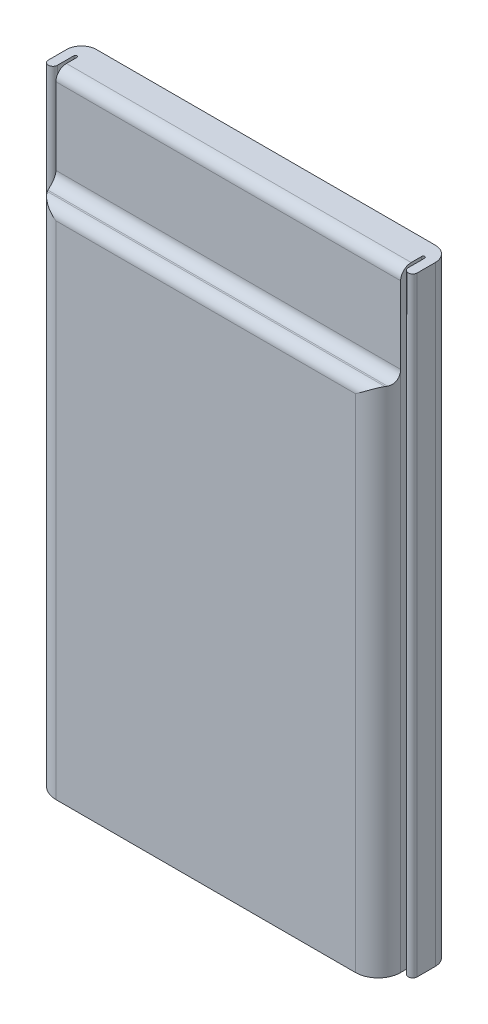
ISO-10303-21;
HEADER;
FILE_DESCRIPTION(('STEP AP214'),'2;1');
FILE_NAME('part.step','',(''),(''),'','','');
FILE_SCHEMA(('AUTOMOTIVE_DESIGN { 1 0 10303 214 1 1 1 1 }'));
ENDSEC;
DATA;
#1=APPLICATION_CONTEXT('core data for automotive mechanical design processes');
#2=APPLICATION_PROTOCOL_DEFINITION('international standard','automotive_design',2000,#1);
#3=PRODUCT_CONTEXT('',#1,'mechanical');
#4=PRODUCT('Part','Part','',(#3));
#5=PRODUCT_RELATED_PRODUCT_CATEGORY('part','',(#4));
#6=PRODUCT_DEFINITION_FORMATION('','',#4);
#7=PRODUCT_DEFINITION_CONTEXT('part definition',#1,'design');
#8=PRODUCT_DEFINITION('design','',#6,#7);
#9=PRODUCT_DEFINITION_SHAPE('','',#8);
#10=(LENGTH_UNIT() NAMED_UNIT(*) SI_UNIT(.MILLI.,.METRE.));
#11=(NAMED_UNIT(*) PLANE_ANGLE_UNIT() SI_UNIT($,.RADIAN.));
#12=(NAMED_UNIT(*) SI_UNIT($,.STERADIAN.) SOLID_ANGLE_UNIT());
#13=UNCERTAINTY_MEASURE_WITH_UNIT(LENGTH_MEASURE(1.E-05),#10,'distance_accuracy_value','');
#14=(GEOMETRIC_REPRESENTATION_CONTEXT(3) GLOBAL_UNCERTAINTY_ASSIGNED_CONTEXT((#13)) GLOBAL_UNIT_ASSIGNED_CONTEXT((#10,
#11,#12)) REPRESENTATION_CONTEXT('',''));
#15=CARTESIAN_POINT('',(0.,0.,0.));
#16=DIRECTION('',(0.,0.,1.));
#17=DIRECTION('',(1.,0.,0.));
#18=AXIS2_PLACEMENT_3D('',#15,#16,#17);
#19=CARTESIAN_POINT('',(-11.45,20.25,2.5));
#20=DIRECTION('',(1.,0.,0.));
#21=DIRECTION('',(0.,0.,-1.));
#22=AXIS2_PLACEMENT_3D('',#19,#20,#21);
#23=PLANE('',#22);
#24=CARTESIAN_POINT('',(-11.45,19.55,1.8));
#25=DIRECTION('',(1.,0.,0.));
#26=DIRECTION('',(0.,0.,-1.));
#27=AXIS2_PLACEMENT_3D('',#24,#25,#26);
#28=CIRCLE('',#27,0.700000000000001);
#29=CARTESIAN_POINT('',(-11.45,20.25,1.8));
#30=VERTEX_POINT('',#29);
#31=CARTESIAN_POINT('',(-11.45,19.55,2.5));
#32=VERTEX_POINT('',#31);
#33=EDGE_CURVE('E452',#30,#32,#28,.T.);
#34=ORIENTED_EDGE('',*,*,#33,.F.);
#35=DIRECTION('',(0.,0.,1.));
#36=VECTOR('',#35,1.);
#37=CARTESIAN_POINT('',(-11.45,20.25,2.5));
#38=LINE('',#37,#36);
#39=CARTESIAN_POINT('',(-11.45,20.25,1.1));
#40=VERTEX_POINT('',#39);
#41=EDGE_CURVE('E268',#40,#30,#38,.T.);
#42=ORIENTED_EDGE('',*,*,#41,.F.);
#43=DIRECTION('',(0.,-1.,0.));
#44=VECTOR('',#43,1.);
#45=CARTESIAN_POINT('',(-11.45,20.25,1.1));
#46=LINE('',#45,#44);
#47=CARTESIAN_POINT('',(-11.45,-20.25,1.1));
#48=VERTEX_POINT('',#47);
#49=EDGE_CURVE('E236',#40,#48,#46,.T.);
#50=ORIENTED_EDGE('',*,*,#49,.T.);
#51=DIRECTION('',(0.,0.,1.));
#52=VECTOR('',#51,1.);
#53=CARTESIAN_POINT('',(-11.45,-20.25,2.5));
#54=LINE('',#53,#52);
#55=CARTESIAN_POINT('',(-11.45,-20.25,2.5));
#56=VERTEX_POINT('',#55);
#57=EDGE_CURVE('E191',#48,#56,#54,.T.);
#58=ORIENTED_EDGE('',*,*,#57,.T.);
#59=DIRECTION('',(0.,-1.,0.));
#60=VECTOR('',#59,1.);
#61=CARTESIAN_POINT('',(-11.45,20.25,2.5));
#62=LINE('',#61,#60);
#63=CARTESIAN_POINT('',(-11.45,14.45,2.5));
#64=VERTEX_POINT('',#63);
#65=EDGE_CURVE('E234',#64,#56,#62,.T.);
#66=ORIENTED_EDGE('',*,*,#65,.F.);
#67=DIRECTION('',(0.,-1.,0.));
#68=VECTOR('',#67,1.);
#69=CARTESIAN_POINT('',(-11.45,20.25,2.5));
#70=LINE('',#69,#68);
#71=EDGE_CURVE('E435',#32,#64,#70,.T.);
#72=ORIENTED_EDGE('',*,*,#71,.F.);
#73=EDGE_LOOP('',(#34,#42,#50,#58,#66,#72));
#74=FACE_BOUND('',#73,.T.);
#75=ADVANCED_FACE('F35',(#74),#23,.F.);
#76=CARTESIAN_POINT('',(-9.95,20.25,2.5));
#77=DIRECTION('',(0.,-1.,0.));
#78=DIRECTION('',(0.,0.,-1.));
#79=AXIS2_PLACEMENT_3D('',#76,#77,#78);
#80=CYLINDRICAL_SURFACE('',#79,1.5);
#81=CARTESIAN_POINT('',(-11.45,14.45,2.5));
#82=CARTESIAN_POINT('',(-11.4499561462918,14.4107046356708,2.49996665730778));
#83=CARTESIAN_POINT('',(-11.4499992482191,14.3714183542362,2.50330687650236));
#84=CARTESIAN_POINT('',(-11.4499354164387,14.293967429043,2.51649162392108));
#85=CARTESIAN_POINT('',(-11.4498285413028,14.2558023533524,2.52633361216168));
#86=CARTESIAN_POINT('',(-11.4491410740691,14.1816427129099,2.55228720768836));
#87=CARTESIAN_POINT('',(-11.448560198109,14.145649462663,2.56840256885166));
#88=CARTESIAN_POINT('',(-11.4463416248353,14.0768985139939,2.60642040046059));
#89=CARTESIAN_POINT('',(-11.4447040963163,14.0441402997553,2.62832194626366));
#90=CARTESIAN_POINT('',(-11.4397174760021,13.9831035334169,2.677010616108));
#91=CARTESIAN_POINT('',(-11.4363838519975,13.9547874718156,2.70375220489332));
#92=CARTESIAN_POINT('',(-11.4273485077593,13.9031440562724,2.76131822449821));
#93=CARTESIAN_POINT('',(-11.4216483772418,13.879813369279,2.79213990504022));
#94=CARTESIAN_POINT('',(-11.4076029305689,13.8395024190182,2.85553925871004));
#95=CARTESIAN_POINT('',(-11.3993602479741,13.8223237472487,2.88801374582642));
#96=CARTESIAN_POINT('',(-11.3799019482591,13.7934557940061,2.95451175346917));
#97=CARTESIAN_POINT('',(-11.3686838942042,13.781771034092,2.98853652472772));
#98=CARTESIAN_POINT('',(-11.3449002980657,13.7650221516101,3.05250454046783));
#99=CARTESIAN_POINT('',(-11.3326903337623,13.7593026309378,3.08241352289095));
#100=CARTESIAN_POINT('',(-11.3061914981021,13.7517861713414,3.14172953845446));
#101=CARTESIAN_POINT('',(-11.2919070504446,13.749981012626,3.17113749452254));
#102=CARTESIAN_POINT('',(-11.2766499161422,13.75,3.2));
#103=B_SPLINE_CURVE_WITH_KNOTS('',3,(#81,#82,#83,#84,#85,#86,#87,#88,#89,#90,#91,#92,#93,#94,
#95,#96,#97,#98,#99,#100,#101,#102),.UNSPECIFIED.,.F.,.F.,(4,2,2,2,2,2,2,2,2,2,4),(0.,
0.117731700981388,0.235417436029151,0.353173700690374,0.470911159062051,0.587593641092845,
0.70419786741187,0.816603597131317,0.929101676953001,1.0272186022184,1.12512929085055),.UNSPECIFIED.);
#104=CARTESIAN_POINT('',(-11.2766499161422,13.75,3.2));
#105=VERTEX_POINT('',#104);
#106=EDGE_CURVE('E432',#64,#105,#103,.T.);
#107=ORIENTED_EDGE('',*,*,#106,.F.);
#108=ORIENTED_EDGE('',*,*,#65,.T.);
#109=CARTESIAN_POINT('',(-9.95,-20.25,2.5));
#110=DIRECTION('',(0.,1.,0.));
#111=DIRECTION('',(0.,0.,1.));
#112=AXIS2_PLACEMENT_3D('',#109,#110,#111);
#113=CIRCLE('',#112,1.5);
#114=CARTESIAN_POINT('',(-9.95,-20.25,4.));
#115=VERTEX_POINT('',#114);
#116=EDGE_CURVE('E194',#56,#115,#113,.T.);
#117=ORIENTED_EDGE('',*,*,#116,.T.);
#118=DIRECTION('',(0.,-1.,0.));
#119=VECTOR('',#118,1.);
#120=CARTESIAN_POINT('',(-9.95,20.25,4.));
#121=LINE('',#120,#119);
#122=CARTESIAN_POINT('',(-9.95,13.05,4.));
#123=VERTEX_POINT('',#122);
#124=EDGE_CURVE('E232',#123,#115,#121,.T.);
#125=ORIENTED_EDGE('',*,*,#124,.F.);
#126=CARTESIAN_POINT('',(-11.218857754045,13.75,3.3));
#127=CARTESIAN_POINT('',(-11.2027784417981,13.7499982055545,3.32551396463836));
#128=CARTESIAN_POINT('',(-11.1859410582917,13.7486060689017,3.35050252186088));
#129=CARTESIAN_POINT('',(-11.1509676886166,13.7433665296013,3.39920481996247));
#130=CARTESIAN_POINT('',(-11.1328347064415,13.7395246527944,3.42292130005024));
#131=CARTESIAN_POINT('',(-11.0771702625634,13.724922406964,3.49142221954591));
#132=CARTESIAN_POINT('',(-11.0379636566091,13.7110687175682,3.53420132491162));
#133=CARTESIAN_POINT('',(-10.9458598687308,13.672878872689,3.62401554035445));
#134=CARTESIAN_POINT('',(-10.8920377008067,13.6467617112175,3.66930815190718));
#135=CARTESIAN_POINT('',(-10.7808303258263,13.587882443994,3.75080325405991));
#136=CARTESIAN_POINT('',(-10.7234254431628,13.5550808982158,3.78694879598609));
#137=CARTESIAN_POINT('',(-10.5825796058719,13.4708369597608,3.86331326015554));
#138=CARTESIAN_POINT('',(-10.4980697193284,13.417248573335,3.89917970849284));
#139=CARTESIAN_POINT('',(-10.3270548572683,13.3056468566581,3.95461504825333));
#140=CARTESIAN_POINT('',(-10.240552975085,13.2476401017938,3.97420766027137));
#141=CARTESIAN_POINT('',(-10.0880345556902,13.1442840524471,3.99509898601819));
#142=CARTESIAN_POINT('',(-10.022197069673,13.0993196280477,3.99970591144029));
#143=CARTESIAN_POINT('',(-9.95426397648777,13.0529128504283,3.99999545061156));
#144=CARTESIAN_POINT('',(-9.95213196446319,13.0514564089068,3.99999999550149));
#145=CARTESIAN_POINT('',(-9.95,13.05,4.));
#146=B_SPLINE_CURVE_WITH_KNOTS('',3,(#126,#127,#128,#129,#130,#131,#132,#133,#134,#135,#136,
#137,#138,#139,#140,#141,#142,#143,#144,#145),.UNSPECIFIED.,.F.,.F.,(4,2,2,2,2,2,2,2,2,4),(0.,
0.0903647747938606,0.180526432789836,0.358599701535537,0.582545843187154,0.807853726825027,
1.12506490330324,1.44181290024313,1.68087549653736,1.688621475233),.UNSPECIFIED.);
#147=CARTESIAN_POINT('',(-11.218857754045,13.75,3.3));
#148=VERTEX_POINT('',#147);
#149=EDGE_CURVE('E433',#148,#123,#146,.T.);
#150=ORIENTED_EDGE('',*,*,#149,.F.);
#151=CARTESIAN_POINT('',(-9.95,13.75,2.5));
#152=DIRECTION('',(0.,-1.,0.));
#153=DIRECTION('',(0.,0.,-1.));
#154=AXIS2_PLACEMENT_3D('',#151,#152,#153);
#155=CIRCLE('',#154,1.5);
#156=EDGE_CURVE('E426',#105,#148,#155,.F.);
#157=ORIENTED_EDGE('',*,*,#156,.F.);
#158=EDGE_LOOP('',(#107,#108,#117,#125,#150,#157));
#159=FACE_BOUND('',#158,.T.);
#160=ADVANCED_FACE('F360',(#159),#80,.T.);
#161=CARTESIAN_POINT('',(9.95000000000001,20.25,2.5));
#162=DIRECTION('',(0.,-1.,0.));
#163=DIRECTION('',(0.,0.,-1.));
#164=AXIS2_PLACEMENT_3D('',#161,#162,#163);
#165=CYLINDRICAL_SURFACE('',#164,1.5);
#166=CARTESIAN_POINT('',(11.45,14.45,2.5));
#167=CARTESIAN_POINT('',(11.4499561462918,14.4107046356708,2.49996665730778));
#168=CARTESIAN_POINT('',(11.4499992482191,14.3714183542362,2.50330687650236));
#169=CARTESIAN_POINT('',(11.4499354164387,14.293967429043,2.51649162392108));
#170=CARTESIAN_POINT('',(11.4498285413028,14.2558023533524,2.52633361216168));
#171=CARTESIAN_POINT('',(11.4491410740691,14.1816427129099,2.55228720768836));
#172=CARTESIAN_POINT('',(11.448560198109,14.145649462663,2.56840256885166));
#173=CARTESIAN_POINT('',(11.4463416248353,14.0768985139939,2.60642040046059));
#174=CARTESIAN_POINT('',(11.4447040963163,14.0441402997553,2.62832194626366));
#175=CARTESIAN_POINT('',(11.4397174760021,13.9831035334169,2.677010616108));
#176=CARTESIAN_POINT('',(11.4363838519975,13.9547874718156,2.70375220489331));
#177=CARTESIAN_POINT('',(11.4273485077593,13.9031440562724,2.76131822449821));
#178=CARTESIAN_POINT('',(11.4216483772418,13.879813369279,2.79213990504022));
#179=CARTESIAN_POINT('',(11.4076029305689,13.8395024190182,2.85553925871004));
#180=CARTESIAN_POINT('',(11.3993602479741,13.8223237472487,2.88801374582642));
#181=CARTESIAN_POINT('',(11.3799019482591,13.7934557940061,2.95451175346917));
#182=CARTESIAN_POINT('',(11.3686838942042,13.781771034092,2.98853652472772));
#183=CARTESIAN_POINT('',(11.3449002980657,13.7650221516101,3.05250454046783));
#184=CARTESIAN_POINT('',(11.3326903337623,13.7593026309378,3.08241352289095));
#185=CARTESIAN_POINT('',(11.3061914981021,13.7517861713414,3.14172953845446));
#186=CARTESIAN_POINT('',(11.2919070504447,13.749981012626,3.17113749452254));
#187=CARTESIAN_POINT('',(11.2766499161422,13.75,3.2));
#188=B_SPLINE_CURVE_WITH_KNOTS('',3,(#166,#167,#168,#169,#170,#171,#172,#173,#174,#175,#176,
#177,#178,#179,#180,#181,#182,#183,#184,#185,#186,#187),.UNSPECIFIED.,.F.,.F.,(4,2,2,2,2,2,2,2,
2,2,4),(0.,0.117731700981388,0.235417436029151,0.353173700690374,0.470911159062051,
0.587593641092844,0.704197867411869,0.816603597131317,0.929101676953001,1.0272186022184,
1.12512929085055),.UNSPECIFIED.);
#189=CARTESIAN_POINT('',(11.45,14.45,2.5));
#190=VERTEX_POINT('',#189);
#191=CARTESIAN_POINT('',(11.2766499161422,13.75,3.2));
#192=VERTEX_POINT('',#191);
#193=EDGE_CURVE('E339',#190,#192,#188,.T.);
#194=ORIENTED_EDGE('',*,*,#193,.T.);
#195=CARTESIAN_POINT('',(9.95000000000001,13.75,2.5));
#196=DIRECTION('',(0.,1.,0.));
#197=DIRECTION('',(0.,0.,1.));
#198=AXIS2_PLACEMENT_3D('',#195,#196,#197);
#199=CIRCLE('',#198,1.5);
#200=CARTESIAN_POINT('',(11.218857754045,13.75,3.3));
#201=VERTEX_POINT('',#200);
#202=EDGE_CURVE('E325',#192,#201,#199,.F.);
#203=ORIENTED_EDGE('',*,*,#202,.T.);
#204=CARTESIAN_POINT('',(11.218857754045,13.75,3.3));
#205=CARTESIAN_POINT('',(11.2027784417981,13.7499982055545,3.32551396463836));
#206=CARTESIAN_POINT('',(11.1859410582917,13.7486060689017,3.35050252186088));
#207=CARTESIAN_POINT('',(11.1509676886166,13.7433665296013,3.39920481996247));
#208=CARTESIAN_POINT('',(11.1328347064415,13.7395246527944,3.42292130005025));
#209=CARTESIAN_POINT('',(11.0771702625634,13.724922406964,3.49142221954592));
#210=CARTESIAN_POINT('',(11.0379636566091,13.7110687175682,3.53420132491162));
#211=CARTESIAN_POINT('',(10.9458598687309,13.672878872689,3.62401554035445));
#212=CARTESIAN_POINT('',(10.8920377008067,13.6467617112175,3.66930815190718));
#213=CARTESIAN_POINT('',(10.7808303258263,13.587882443994,3.75080325405991));
#214=CARTESIAN_POINT('',(10.7234254431628,13.5550808982158,3.78694879598609));
#215=CARTESIAN_POINT('',(10.5825796058719,13.4708369597608,3.86331326015554));
#216=CARTESIAN_POINT('',(10.4980697193284,13.417248573335,3.89917970849285));
#217=CARTESIAN_POINT('',(10.3270548572683,13.3056468566582,3.95461504825333));
#218=CARTESIAN_POINT('',(10.2405529750849,13.2476401017939,3.97420766027137));
#219=CARTESIAN_POINT('',(10.0880345556903,13.144284052447,3.99509898601819));
#220=CARTESIAN_POINT('',(10.0221970696733,13.0993196280473,3.99970591144029));
#221=CARTESIAN_POINT('',(9.95426397648779,13.0529128504283,3.99999545061156));
#222=CARTESIAN_POINT('',(9.9521319644632,13.0514564089068,3.99999999550149));
#223=CARTESIAN_POINT('',(9.95000000000001,13.05,4.));
#224=B_SPLINE_CURVE_WITH_KNOTS('',3,(#204,#205,#206,#207,#208,#209,#210,#211,#212,#213,#214,
#215,#216,#217,#218,#219,#220,#221,#222,#223),.UNSPECIFIED.,.F.,.F.,(4,2,2,2,2,2,2,2,2,4),(0.,
0.0903647747938624,0.180526432789841,0.358599701535538,0.582545843187154,0.807853726825027,
1.12506490330324,1.44181290024313,1.68087549653736,1.688621475233),.UNSPECIFIED.);
#225=CARTESIAN_POINT('',(9.95000000000001,13.05,4.));
#226=VERTEX_POINT('',#225);
#227=EDGE_CURVE('E316',#201,#226,#224,.T.);
#228=ORIENTED_EDGE('',*,*,#227,.T.);
#229=DIRECTION('',(0.,-1.,0.));
#230=VECTOR('',#229,1.);
#231=CARTESIAN_POINT('',(9.95000000000001,20.25,4.));
#232=LINE('',#231,#230);
#233=CARTESIAN_POINT('',(9.95000000000001,-20.25,4.));
#234=VERTEX_POINT('',#233);
#235=EDGE_CURVE('E230',#226,#234,#232,.T.);
#236=ORIENTED_EDGE('',*,*,#235,.T.);
#237=CARTESIAN_POINT('',(9.95000000000001,-20.25,2.5));
#238=DIRECTION('',(0.,1.,0.));
#239=DIRECTION('',(0.,0.,-1.));
#240=AXIS2_PLACEMENT_3D('',#237,#238,#239);
#241=CIRCLE('',#240,1.5);
#242=CARTESIAN_POINT('',(11.45,-20.25,2.5));
#243=VERTEX_POINT('',#242);
#244=EDGE_CURVE('E200',#234,#243,#241,.T.);
#245=ORIENTED_EDGE('',*,*,#244,.T.);
#246=DIRECTION('',(0.,-1.,0.));
#247=VECTOR('',#246,1.);
#248=CARTESIAN_POINT('',(11.45,20.25,2.5));
#249=LINE('',#248,#247);
#250=EDGE_CURVE('E228',#190,#243,#249,.T.);
#251=ORIENTED_EDGE('',*,*,#250,.F.);
#252=EDGE_LOOP('',(#194,#203,#228,#236,#245,#251));
#253=FACE_BOUND('',#252,.T.);
#254=ADVANCED_FACE('F366',(#253),#165,.T.);
#255=CARTESIAN_POINT('',(11.45,20.25,1.10000000000001));
#256=DIRECTION('',(-1.,0.,0.));
#257=DIRECTION('',(0.,0.,1.));
#258=AXIS2_PLACEMENT_3D('',#255,#256,#257);
#259=PLANE('',#258);
#260=CARTESIAN_POINT('',(11.45,19.55,1.8));
#261=DIRECTION('',(-1.,0.,0.));
#262=DIRECTION('',(0.,0.,1.));
#263=AXIS2_PLACEMENT_3D('',#260,#261,#262);
#264=CIRCLE('',#263,0.700000000000001);
#265=CARTESIAN_POINT('',(11.45,20.25,1.8));
#266=VERTEX_POINT('',#265);
#267=CARTESIAN_POINT('',(11.45,19.55,2.5));
#268=VERTEX_POINT('',#267);
#269=EDGE_CURVE('E50',#266,#268,#264,.F.);
#270=ORIENTED_EDGE('',*,*,#269,.T.);
#271=DIRECTION('',(0.,-1.,0.));
#272=VECTOR('',#271,1.);
#273=CARTESIAN_POINT('',(11.45,19.55,2.5));
#274=LINE('',#273,#272);
#275=EDGE_CURVE('E183',#268,#190,#274,.T.);
#276=ORIENTED_EDGE('',*,*,#275,.T.);
#277=ORIENTED_EDGE('',*,*,#250,.T.);
#278=DIRECTION('',(0.,0.,-1.));
#279=VECTOR('',#278,1.);
#280=CARTESIAN_POINT('',(11.45,-20.25,1.10000000000001));
#281=LINE('',#280,#279);
#282=CARTESIAN_POINT('',(11.45,-20.25,1.10000000000001));
#283=VERTEX_POINT('',#282);
#284=EDGE_CURVE('E203',#243,#283,#281,.T.);
#285=ORIENTED_EDGE('',*,*,#284,.T.);
#286=DIRECTION('',(0.,-1.,0.));
#287=VECTOR('',#286,1.);
#288=CARTESIAN_POINT('',(11.45,20.25,1.10000000000001));
#289=LINE('',#288,#287);
#290=CARTESIAN_POINT('',(11.45,20.25,1.10000000000001));
#291=VERTEX_POINT('',#290);
#292=EDGE_CURVE('E225',#291,#283,#289,.T.);
#293=ORIENTED_EDGE('',*,*,#292,.F.);
#294=DIRECTION('',(0.,0.,-1.));
#295=VECTOR('',#294,1.);
#296=CARTESIAN_POINT('',(11.45,20.25,1.10000000000001));
#297=LINE('',#296,#295);
#298=EDGE_CURVE('E271',#266,#291,#297,.T.);
#299=ORIENTED_EDGE('',*,*,#298,.F.);
#300=EDGE_LOOP('',(#270,#276,#277,#285,#293,#299));
#301=FACE_BOUND('',#300,.T.);
#302=ADVANCED_FACE('F383',(#301),#259,.F.);
#303=CARTESIAN_POINT('',(-11.25,20.25,1.));
#304=DIRECTION('',(0.,-1.,0.));
#305=DIRECTION('',(0.,0.,-1.));
#306=AXIS2_PLACEMENT_3D('',#303,#304,#305);
#307=CYLINDRICAL_SURFACE('',#306,1.);
#308=CARTESIAN_POINT('',(-11.25,-20.25,1.));
#309=DIRECTION('',(0.,1.,0.));
#310=DIRECTION('',(0.,0.,1.));
#311=AXIS2_PLACEMENT_3D('',#308,#309,#310);
#312=CIRCLE('',#311,1.);
#313=CARTESIAN_POINT('',(-11.25,-20.25,0.));
#314=VERTEX_POINT('',#313);
#315=CARTESIAN_POINT('',(-12.25,-20.25,1.));
#316=VERTEX_POINT('',#315);
#317=EDGE_CURVE('E179',#314,#316,#312,.T.);
#318=ORIENTED_EDGE('',*,*,#317,.T.);
#319=DIRECTION('',(0.,-1.,0.));
#320=VECTOR('',#319,1.);
#321=CARTESIAN_POINT('',(-12.25,20.25,1.));
#322=LINE('',#321,#320);
#323=CARTESIAN_POINT('',(-12.25,20.25,1.));
#324=VERTEX_POINT('',#323);
#325=EDGE_CURVE('E11',#324,#316,#322,.T.);
#326=ORIENTED_EDGE('',*,*,#325,.F.);
#327=CARTESIAN_POINT('',(-11.25,20.25,1.));
#328=DIRECTION('',(0.,1.,0.));
#329=DIRECTION('',(0.,0.,1.));
#330=AXIS2_PLACEMENT_3D('',#327,#328,#329);
#331=CIRCLE('',#330,1.);
#332=CARTESIAN_POINT('',(-11.25,20.25,0.));
#333=VERTEX_POINT('',#332);
#334=EDGE_CURVE('E215',#333,#324,#331,.T.);
#335=ORIENTED_EDGE('',*,*,#334,.F.);
#336=DIRECTION('',(0.,-1.,0.));
#337=VECTOR('',#336,1.);
#338=CARTESIAN_POINT('',(-11.25,20.25,0.));
#339=LINE('',#338,#337);
#340=EDGE_CURVE('E175',#333,#314,#339,.T.);
#341=ORIENTED_EDGE('',*,*,#340,.T.);
#342=EDGE_LOOP('',(#318,#326,#335,#341));
#343=FACE_BOUND('',#342,.T.);
#344=ADVANCED_FACE('F37',(#343),#307,.T.);
#345=CARTESIAN_POINT('',(-12.25,20.25,1.));
#346=DIRECTION('',(1.,0.,0.));
#347=DIRECTION('',(0.,0.,-1.));
#348=AXIS2_PLACEMENT_3D('',#345,#346,#347);
#349=PLANE('',#348);
#350=DIRECTION('',(0.,0.,1.));
#351=VECTOR('',#350,1.);
#352=CARTESIAN_POINT('',(-12.25,-20.25,1.));
#353=LINE('',#352,#351);
#354=CARTESIAN_POINT('',(-12.25,-20.25,2.2));
#355=VERTEX_POINT('',#354);
#356=EDGE_CURVE('E182',#316,#355,#353,.T.);
#357=ORIENTED_EDGE('',*,*,#356,.T.);
#358=DIRECTION('',(0.,-1.,0.));
#359=VECTOR('',#358,1.);
#360=CARTESIAN_POINT('',(-12.25,20.25,2.2));
#361=LINE('',#360,#359);
#362=CARTESIAN_POINT('',(-12.25,20.25,2.2));
#363=VERTEX_POINT('',#362);
#364=EDGE_CURVE('E43',#363,#355,#361,.T.);
#365=ORIENTED_EDGE('',*,*,#364,.F.);
#366=DIRECTION('',(0.,0.,1.));
#367=VECTOR('',#366,1.);
#368=CARTESIAN_POINT('',(-12.25,20.25,1.));
#369=LINE('',#368,#367);
#370=EDGE_CURVE('E124',#324,#363,#369,.T.);
#371=ORIENTED_EDGE('',*,*,#370,.F.);
#372=ORIENTED_EDGE('',*,*,#325,.T.);
#373=EDGE_LOOP('',(#357,#365,#371,#372));
#374=FACE_BOUND('',#373,.T.);
#375=ADVANCED_FACE('F378',(#374),#349,.F.);
#376=CARTESIAN_POINT('',(-11.95,20.25,2.2));
#377=DIRECTION('',(0.,-1.,0.));
#378=DIRECTION('',(0.,0.,-1.));
#379=AXIS2_PLACEMENT_3D('',#376,#377,#378);
#380=CYLINDRICAL_SURFACE('',#379,0.3);
#381=CARTESIAN_POINT('',(-11.95,-20.25,2.2));
#382=DIRECTION('',(0.,1.,0.));
#383=DIRECTION('',(0.,0.,1.));
#384=AXIS2_PLACEMENT_3D('',#381,#382,#383);
#385=CIRCLE('',#384,0.3);
#386=CARTESIAN_POINT('',(-11.65,-20.25,2.2));
#387=VERTEX_POINT('',#386);
#388=EDGE_CURVE('E185',#355,#387,#385,.T.);
#389=ORIENTED_EDGE('',*,*,#388,.T.);
#390=DIRECTION('',(0.,-1.,0.));
#391=VECTOR('',#390,1.);
#392=CARTESIAN_POINT('',(-11.65,20.25,2.2));
#393=LINE('',#392,#391);
#394=CARTESIAN_POINT('',(-11.65,20.25,2.2));
#395=VERTEX_POINT('',#394);
#396=EDGE_CURVE('E242',#395,#387,#393,.T.);
#397=ORIENTED_EDGE('',*,*,#396,.F.);
#398=CARTESIAN_POINT('',(-11.95,20.25,2.2));
#399=DIRECTION('',(0.,1.,0.));
#400=DIRECTION('',(0.,0.,1.));
#401=AXIS2_PLACEMENT_3D('',#398,#399,#400);
#402=CIRCLE('',#401,0.3);
#403=EDGE_CURVE('E250',#363,#395,#402,.T.);
#404=ORIENTED_EDGE('',*,*,#403,.F.);
#405=ORIENTED_EDGE('',*,*,#364,.T.);
#406=EDGE_LOOP('',(#389,#397,#404,#405));
#407=FACE_BOUND('',#406,.T.);
#408=ADVANCED_FACE('F248',(#407),#380,.T.);
#409=CARTESIAN_POINT('',(-11.65,20.25,2.2));
#410=DIRECTION('',(-1.,0.,0.));
#411=DIRECTION('',(0.,0.,1.));
#412=AXIS2_PLACEMENT_3D('',#409,#410,#411);
#413=PLANE('',#412);
#414=DIRECTION('',(0.,0.,-1.));
#415=VECTOR('',#414,1.);
#416=CARTESIAN_POINT('',(-11.65,-20.25,2.2));
#417=LINE('',#416,#415);
#418=CARTESIAN_POINT('',(-11.65,-20.25,1.1));
#419=VERTEX_POINT('',#418);
#420=EDGE_CURVE('E187',#387,#419,#417,.T.);
#421=ORIENTED_EDGE('',*,*,#420,.T.);
#422=DIRECTION('',(0.,-1.,0.));
#423=VECTOR('',#422,1.);
#424=CARTESIAN_POINT('',(-11.65,20.25,1.1));
#425=LINE('',#424,#423);
#426=CARTESIAN_POINT('',(-11.65,20.25,1.1));
#427=VERTEX_POINT('',#426);
#428=EDGE_CURVE('E239',#427,#419,#425,.T.);
#429=ORIENTED_EDGE('',*,*,#428,.F.);
#430=DIRECTION('',(0.,0.,-1.));
#431=VECTOR('',#430,1.);
#432=CARTESIAN_POINT('',(-11.65,20.25,2.2));
#433=LINE('',#432,#431);
#434=EDGE_CURVE('E269',#395,#427,#433,.T.);
#435=ORIENTED_EDGE('',*,*,#434,.F.);
#436=ORIENTED_EDGE('',*,*,#396,.T.);
#437=EDGE_LOOP('',(#421,#429,#435,#436));
#438=FACE_BOUND('',#437,.T.);
#439=ADVANCED_FACE('F259',(#438),#413,.F.);
#440=CARTESIAN_POINT('',(-11.55,20.25,1.1));
#441=DIRECTION('',(0.,-1.,0.));
#442=DIRECTION('',(0.,0.,-1.));
#443=AXIS2_PLACEMENT_3D('',#440,#441,#442);
#444=CYLINDRICAL_SURFACE('',#443,0.0999999999999994);
#445=CARTESIAN_POINT('',(-11.55,-20.25,1.1));
#446=DIRECTION('',(0.,-1.,0.));
#447=DIRECTION('',(0.,0.,1.));
#448=AXIS2_PLACEMENT_3D('',#445,#446,#447);
#449=CIRCLE('',#448,0.0999999999999994);
#450=EDGE_CURVE('E189',#419,#48,#449,.T.);
#451=ORIENTED_EDGE('',*,*,#450,.T.);
#452=ORIENTED_EDGE('',*,*,#49,.F.);
#453=CARTESIAN_POINT('',(-11.55,20.25,1.1));
#454=DIRECTION('',(0.,-1.,0.));
#455=DIRECTION('',(0.,0.,1.));
#456=AXIS2_PLACEMENT_3D('',#453,#454,#455);
#457=CIRCLE('',#456,0.0999999999999994);
#458=EDGE_CURVE('E265',#427,#40,#457,.T.);
#459=ORIENTED_EDGE('',*,*,#458,.F.);
#460=ORIENTED_EDGE('',*,*,#428,.T.);
#461=EDGE_LOOP('',(#451,#452,#459,#460));
#462=FACE_BOUND('',#461,.T.);
#463=ADVANCED_FACE('F263',(#462),#444,.F.);
#464=CARTESIAN_POINT('',(-9.95,20.25,4.));
#465=DIRECTION('',(0.,0.,-1.));
#466=DIRECTION('',(-1.,0.,0.));
#467=AXIS2_PLACEMENT_3D('',#464,#465,#466);
#468=PLANE('',#467);
#469=ORIENTED_EDGE('',*,*,#235,.F.);
#470=DIRECTION('',(-1.,0.,0.));
#471=VECTOR('',#470,1.);
#472=CARTESIAN_POINT('',(12.251,13.05,4.));
#473=LINE('',#472,#471);
#474=EDGE_CURVE('E301',#226,#123,#473,.T.);
#475=ORIENTED_EDGE('',*,*,#474,.T.);
#476=ORIENTED_EDGE('',*,*,#124,.T.);
#477=DIRECTION('',(1.,0.,0.));
#478=VECTOR('',#477,1.);
#479=CARTESIAN_POINT('',(-9.95,-20.25,4.));
#480=LINE('',#479,#478);
#481=EDGE_CURVE('E197',#115,#234,#480,.T.);
#482=ORIENTED_EDGE('',*,*,#481,.T.);
#483=EDGE_LOOP('',(#469,#475,#476,#482));
#484=FACE_BOUND('',#483,.T.);
#485=ADVANCED_FACE('F374',(#484),#468,.F.);
#486=CARTESIAN_POINT('',(11.55,20.25,1.10000000000001));
#487=DIRECTION('',(0.,-1.,0.));
#488=DIRECTION('',(0.,0.,-1.));
#489=AXIS2_PLACEMENT_3D('',#486,#487,#488);
#490=CYLINDRICAL_SURFACE('',#489,0.0999999999999994);
#491=CARTESIAN_POINT('',(11.55,-20.25,1.10000000000001));
#492=DIRECTION('',(0.,-1.,0.));
#493=DIRECTION('',(0.,0.,-1.));
#494=AXIS2_PLACEMENT_3D('',#491,#492,#493);
#495=CIRCLE('',#494,0.0999999999999994);
#496=CARTESIAN_POINT('',(11.65,-20.25,1.10000000000001));
#497=VERTEX_POINT('',#496);
#498=EDGE_CURVE('E205',#283,#497,#495,.T.);
#499=ORIENTED_EDGE('',*,*,#498,.T.);
#500=DIRECTION('',(0.,-1.,0.));
#501=VECTOR('',#500,1.);
#502=CARTESIAN_POINT('',(11.65,20.25,1.10000000000001));
#503=LINE('',#502,#501);
#504=CARTESIAN_POINT('',(11.65,20.25,1.10000000000001));
#505=VERTEX_POINT('',#504);
#506=EDGE_CURVE('E222',#505,#497,#503,.T.);
#507=ORIENTED_EDGE('',*,*,#506,.F.);
#508=CARTESIAN_POINT('',(11.55,20.25,1.10000000000001));
#509=DIRECTION('',(0.,-1.,0.));
#510=DIRECTION('',(0.,0.,-1.));
#511=AXIS2_PLACEMENT_3D('',#508,#509,#510);
#512=CIRCLE('',#511,0.0999999999999994);
#513=EDGE_CURVE('E277',#291,#505,#512,.T.);
#514=ORIENTED_EDGE('',*,*,#513,.F.);
#515=ORIENTED_EDGE('',*,*,#292,.T.);
#516=EDGE_LOOP('',(#499,#507,#514,#515));
#517=FACE_BOUND('',#516,.T.);
#518=ADVANCED_FACE('F395',(#517),#490,.F.);
#519=CARTESIAN_POINT('',(11.65,20.25,2.20000000000001));
#520=DIRECTION('',(1.,0.,0.));
#521=DIRECTION('',(0.,0.,-1.));
#522=AXIS2_PLACEMENT_3D('',#519,#520,#521);
#523=PLANE('',#522);
#524=DIRECTION('',(0.,0.,1.));
#525=VECTOR('',#524,1.);
#526=CARTESIAN_POINT('',(11.65,-20.25,2.20000000000001));
#527=LINE('',#526,#525);
#528=CARTESIAN_POINT('',(11.65,-20.25,2.20000000000001));
#529=VERTEX_POINT('',#528);
#530=EDGE_CURVE('E207',#497,#529,#527,.T.);
#531=ORIENTED_EDGE('',*,*,#530,.T.);
#532=DIRECTION('',(0.,-1.,0.));
#533=VECTOR('',#532,1.);
#534=CARTESIAN_POINT('',(11.65,20.25,2.20000000000001));
#535=LINE('',#534,#533);
#536=CARTESIAN_POINT('',(11.65,20.25,2.20000000000001));
#537=VERTEX_POINT('',#536);
#538=EDGE_CURVE('E219',#537,#529,#535,.T.);
#539=ORIENTED_EDGE('',*,*,#538,.F.);
#540=DIRECTION('',(0.,0.,1.));
#541=VECTOR('',#540,1.);
#542=CARTESIAN_POINT('',(11.65,20.25,2.20000000000001));
#543=LINE('',#542,#541);
#544=EDGE_CURVE('E279',#505,#537,#543,.T.);
#545=ORIENTED_EDGE('',*,*,#544,.F.);
#546=ORIENTED_EDGE('',*,*,#506,.T.);
#547=EDGE_LOOP('',(#531,#539,#545,#546));
#548=FACE_BOUND('',#547,.T.);
#549=ADVANCED_FACE('F285',(#548),#523,.F.);
#550=CARTESIAN_POINT('',(11.95,20.25,2.20000000000001));
#551=DIRECTION('',(0.,-1.,0.));
#552=DIRECTION('',(0.,0.,-1.));
#553=AXIS2_PLACEMENT_3D('',#550,#551,#552);
#554=CYLINDRICAL_SURFACE('',#553,0.299999999999995);
#555=CARTESIAN_POINT('',(11.95,-20.25,2.20000000000001));
#556=DIRECTION('',(0.,1.,0.));
#557=DIRECTION('',(0.,0.,-1.));
#558=AXIS2_PLACEMENT_3D('',#555,#556,#557);
#559=CIRCLE('',#558,0.299999999999995);
#560=CARTESIAN_POINT('',(12.25,-20.25,2.20000000000001));
#561=VERTEX_POINT('',#560);
#562=EDGE_CURVE('E209',#529,#561,#559,.T.);
#563=ORIENTED_EDGE('',*,*,#562,.T.);
#564=DIRECTION('',(0.,-1.,0.));
#565=VECTOR('',#564,1.);
#566=CARTESIAN_POINT('',(12.25,20.25,2.20000000000001));
#567=LINE('',#566,#565);
#568=CARTESIAN_POINT('',(12.25,20.25,2.20000000000001));
#569=VERTEX_POINT('',#568);
#570=EDGE_CURVE('E170',#569,#561,#567,.T.);
#571=ORIENTED_EDGE('',*,*,#570,.F.);
#572=CARTESIAN_POINT('',(11.95,20.25,2.20000000000001));
#573=DIRECTION('',(0.,1.,0.));
#574=DIRECTION('',(0.,0.,-1.));
#575=AXIS2_PLACEMENT_3D('',#572,#573,#574);
#576=CIRCLE('',#575,0.299999999999995);
#577=EDGE_CURVE('E158',#537,#569,#576,.T.);
#578=ORIENTED_EDGE('',*,*,#577,.F.);
#579=ORIENTED_EDGE('',*,*,#538,.T.);
#580=EDGE_LOOP('',(#563,#571,#578,#579));
#581=FACE_BOUND('',#580,.T.);
#582=ADVANCED_FACE('F289',(#581),#554,.T.);
#583=CARTESIAN_POINT('',(12.25,20.25,1.));
#584=DIRECTION('',(-1.,0.,0.));
#585=DIRECTION('',(0.,0.,1.));
#586=AXIS2_PLACEMENT_3D('',#583,#584,#585);
#587=PLANE('',#586);
#588=DIRECTION('',(0.,0.,-1.));
#589=VECTOR('',#588,1.);
#590=CARTESIAN_POINT('',(12.25,-20.25,1.));
#591=LINE('',#590,#589);
#592=CARTESIAN_POINT('',(12.25,-20.25,1.));
#593=VERTEX_POINT('',#592);
#594=EDGE_CURVE('E167',#561,#593,#591,.T.);
#595=ORIENTED_EDGE('',*,*,#594,.T.);
#596=DIRECTION('',(0.,-1.,0.));
#597=VECTOR('',#596,1.);
#598=CARTESIAN_POINT('',(12.25,20.25,1.));
#599=LINE('',#598,#597);
#600=CARTESIAN_POINT('',(12.25,20.25,1.));
#601=VERTEX_POINT('',#600);
#602=EDGE_CURVE('E164',#601,#593,#599,.T.);
#603=ORIENTED_EDGE('',*,*,#602,.F.);
#604=DIRECTION('',(0.,0.,-1.));
#605=VECTOR('',#604,1.);
#606=CARTESIAN_POINT('',(12.25,20.25,1.));
#607=LINE('',#606,#605);
#608=EDGE_CURVE('E151',#569,#601,#607,.T.);
#609=ORIENTED_EDGE('',*,*,#608,.F.);
#610=ORIENTED_EDGE('',*,*,#570,.T.);
#611=EDGE_LOOP('',(#595,#603,#609,#610));
#612=FACE_BOUND('',#611,.T.);
#613=ADVANCED_FACE('F165',(#612),#587,.F.);
#614=CARTESIAN_POINT('',(11.25,20.25,1.));
#615=DIRECTION('',(0.,-1.,0.));
#616=DIRECTION('',(0.,0.,-1.));
#617=AXIS2_PLACEMENT_3D('',#614,#615,#616);
#618=CYLINDRICAL_SURFACE('',#617,1.);
#619=CARTESIAN_POINT('',(11.25,-20.25,1.));
#620=DIRECTION('',(0.,1.,0.));
#621=DIRECTION('',(0.,0.,-1.));
#622=AXIS2_PLACEMENT_3D('',#619,#620,#621);
#623=CIRCLE('',#622,1.);
#624=CARTESIAN_POINT('',(11.25,-20.25,0.));
#625=VERTEX_POINT('',#624);
#626=EDGE_CURVE('E212',#593,#625,#623,.T.);
#627=ORIENTED_EDGE('',*,*,#626,.T.);
#628=DIRECTION('',(0.,-1.,0.));
#629=VECTOR('',#628,1.);
#630=CARTESIAN_POINT('',(11.25,20.25,0.));
#631=LINE('',#630,#629);
#632=CARTESIAN_POINT('',(11.25,20.25,0.));
#633=VERTEX_POINT('',#632);
#634=EDGE_CURVE('E171',#633,#625,#631,.T.);
#635=ORIENTED_EDGE('',*,*,#634,.F.);
#636=CARTESIAN_POINT('',(11.25,20.25,1.));
#637=DIRECTION('',(0.,1.,0.));
#638=DIRECTION('',(0.,0.,-1.));
#639=AXIS2_PLACEMENT_3D('',#636,#637,#638);
#640=CIRCLE('',#639,1.);
#641=EDGE_CURVE('E155',#601,#633,#640,.T.);
#642=ORIENTED_EDGE('',*,*,#641,.F.);
#643=ORIENTED_EDGE('',*,*,#602,.T.);
#644=EDGE_LOOP('',(#627,#635,#642,#643));
#645=FACE_BOUND('',#644,.T.);
#646=ADVANCED_FACE('F173',(#645),#618,.T.);
#647=CARTESIAN_POINT('',(-11.25,20.25,0.));
#648=DIRECTION('',(0.,0.,1.));
#649=DIRECTION('',(1.,0.,0.));
#650=AXIS2_PLACEMENT_3D('',#647,#648,#649);
#651=PLANE('',#650);
#652=DIRECTION('',(-1.,0.,0.));
#653=VECTOR('',#652,1.);
#654=CARTESIAN_POINT('',(-11.25,-20.25,0.));
#655=LINE('',#654,#653);
#656=EDGE_CURVE('E116',#625,#314,#655,.T.);
#657=ORIENTED_EDGE('',*,*,#656,.T.);
#658=ORIENTED_EDGE('',*,*,#340,.F.);
#659=DIRECTION('',(-1.,0.,0.));
#660=VECTOR('',#659,1.);
#661=CARTESIAN_POINT('',(-11.25,20.25,0.));
#662=LINE('',#661,#660);
#663=EDGE_CURVE('E59',#633,#333,#662,.T.);
#664=ORIENTED_EDGE('',*,*,#663,.F.);
#665=ORIENTED_EDGE('',*,*,#634,.T.);
#666=EDGE_LOOP('',(#657,#658,#664,#665));
#667=FACE_BOUND('',#666,.T.);
#668=ADVANCED_FACE('F290',(#667),#651,.F.);
#669=CARTESIAN_POINT('',(-11.25,20.25,1.));
#670=DIRECTION('',(0.,1.,0.));
#671=DIRECTION('',(0.,0.,1.));
#672=AXIS2_PLACEMENT_3D('',#669,#670,#671);
#673=PLANE('',#672);
#674=DIRECTION('',(-1.,0.,0.));
#675=VECTOR('',#674,1.);
#676=CARTESIAN_POINT('',(12.251,20.25,1.8));
#677=LINE('',#676,#675);
#678=EDGE_CURVE('E299',#266,#30,#677,.T.);
#679=ORIENTED_EDGE('',*,*,#678,.F.);
#680=ORIENTED_EDGE('',*,*,#298,.T.);
#681=ORIENTED_EDGE('',*,*,#513,.T.);
#682=ORIENTED_EDGE('',*,*,#544,.T.);
#683=ORIENTED_EDGE('',*,*,#577,.T.);
#684=ORIENTED_EDGE('',*,*,#608,.T.);
#685=ORIENTED_EDGE('',*,*,#641,.T.);
#686=ORIENTED_EDGE('',*,*,#663,.T.);
#687=ORIENTED_EDGE('',*,*,#334,.T.);
#688=ORIENTED_EDGE('',*,*,#370,.T.);
#689=ORIENTED_EDGE('',*,*,#403,.T.);
#690=ORIENTED_EDGE('',*,*,#434,.T.);
#691=ORIENTED_EDGE('',*,*,#458,.T.);
#692=ORIENTED_EDGE('',*,*,#41,.T.);
#693=EDGE_LOOP('',(#679,#680,#681,#682,#683,#684,#685,#686,#687,#688,#689,#690,#691,#692));
#694=FACE_BOUND('',#693,.T.);
#695=ADVANCED_FACE('F153',(#694),#673,.T.);
#696=CARTESIAN_POINT('',(-11.25,-20.25,1.));
#697=DIRECTION('',(0.,1.,0.));
#698=DIRECTION('',(0.,0.,1.));
#699=AXIS2_PLACEMENT_3D('',#696,#697,#698);
#700=PLANE('',#699);
#701=ORIENTED_EDGE('',*,*,#317,.F.);
#702=ORIENTED_EDGE('',*,*,#656,.F.);
#703=ORIENTED_EDGE('',*,*,#626,.F.);
#704=ORIENTED_EDGE('',*,*,#594,.F.);
#705=ORIENTED_EDGE('',*,*,#562,.F.);
#706=ORIENTED_EDGE('',*,*,#530,.F.);
#707=ORIENTED_EDGE('',*,*,#498,.F.);
#708=ORIENTED_EDGE('',*,*,#284,.F.);
#709=ORIENTED_EDGE('',*,*,#244,.F.);
#710=ORIENTED_EDGE('',*,*,#481,.F.);
#711=ORIENTED_EDGE('',*,*,#116,.F.);
#712=ORIENTED_EDGE('',*,*,#57,.F.);
#713=ORIENTED_EDGE('',*,*,#450,.F.);
#714=ORIENTED_EDGE('',*,*,#420,.F.);
#715=ORIENTED_EDGE('',*,*,#388,.F.);
#716=ORIENTED_EDGE('',*,*,#356,.F.);
#717=EDGE_LOOP('',(#701,#702,#703,#704,#705,#706,#707,#708,#709,#710,#711,#712,#713,#714,#715,#716));
#718=FACE_BOUND('',#717,.T.);
#719=ADVANCED_FACE('F254',(#718),#700,.F.);
#720=CARTESIAN_POINT('',(12.251,19.55,2.5));
#721=DIRECTION('',(0.,0.,1.));
#722=DIRECTION('',(0.,-1.,0.));
#723=AXIS2_PLACEMENT_3D('',#720,#721,#722);
#724=PLANE('',#723);
#725=DIRECTION('',(-1.,0.,0.));
#726=VECTOR('',#725,1.);
#727=CARTESIAN_POINT('',(12.251,19.55,2.5));
#728=LINE('',#727,#726);
#729=EDGE_CURVE('E313',#268,#32,#728,.T.);
#730=ORIENTED_EDGE('',*,*,#729,.T.);
#731=ORIENTED_EDGE('',*,*,#71,.T.);
#732=DIRECTION('',(-1.,0.,0.));
#733=VECTOR('',#732,1.);
#734=CARTESIAN_POINT('',(12.251,14.45,2.5));
#735=LINE('',#734,#733);
#736=EDGE_CURVE('E310',#190,#64,#735,.T.);
#737=ORIENTED_EDGE('',*,*,#736,.F.);
#738=ORIENTED_EDGE('',*,*,#275,.F.);
#739=EDGE_LOOP('',(#730,#731,#737,#738));
#740=FACE_BOUND('',#739,.T.);
#741=ADVANCED_FACE('F336',(#740),#724,.T.);
#742=CARTESIAN_POINT('',(12.251,14.45,3.2));
#743=DIRECTION('',(-1.,0.,0.));
#744=DIRECTION('',(0.,0.,1.));
#745=AXIS2_PLACEMENT_3D('',#742,#743,#744);
#746=CYLINDRICAL_SURFACE('',#745,0.699999999999999);
#747=ORIENTED_EDGE('',*,*,#736,.T.);
#748=ORIENTED_EDGE('',*,*,#106,.T.);
#749=DIRECTION('',(-1.,0.,0.));
#750=VECTOR('',#749,1.);
#751=CARTESIAN_POINT('',(12.251,13.75,3.2));
#752=LINE('',#751,#750);
#753=EDGE_CURVE('E307',#192,#105,#752,.T.);
#754=ORIENTED_EDGE('',*,*,#753,.F.);
#755=ORIENTED_EDGE('',*,*,#193,.F.);
#756=EDGE_LOOP('',(#747,#748,#754,#755));
#757=FACE_BOUND('',#756,.T.);
#758=ADVANCED_FACE('F347',(#757),#746,.F.);
#759=CARTESIAN_POINT('',(12.251,13.75,3.2));
#760=DIRECTION('',(0.,1.,0.));
#761=DIRECTION('',(0.,0.,1.));
#762=AXIS2_PLACEMENT_3D('',#759,#760,#761);
#763=PLANE('',#762);
#764=ORIENTED_EDGE('',*,*,#753,.T.);
#765=ORIENTED_EDGE('',*,*,#156,.T.);
#766=DIRECTION('',(-1.,0.,0.));
#767=VECTOR('',#766,1.);
#768=CARTESIAN_POINT('',(12.251,13.75,3.3));
#769=LINE('',#768,#767);
#770=EDGE_CURVE('E304',#201,#148,#769,.T.);
#771=ORIENTED_EDGE('',*,*,#770,.F.);
#772=ORIENTED_EDGE('',*,*,#202,.F.);
#773=EDGE_LOOP('',(#764,#765,#771,#772));
#774=FACE_BOUND('',#773,.T.);
#775=ADVANCED_FACE('F350',(#774),#763,.T.);
#776=CARTESIAN_POINT('',(12.251,13.05,3.3));
#777=DIRECTION('',(-1.,0.,0.));
#778=DIRECTION('',(0.,0.,1.));
#779=AXIS2_PLACEMENT_3D('',#776,#777,#778);
#780=CYLINDRICAL_SURFACE('',#779,0.7);
#781=ORIENTED_EDGE('',*,*,#770,.T.);
#782=ORIENTED_EDGE('',*,*,#149,.T.);
#783=ORIENTED_EDGE('',*,*,#474,.F.);
#784=ORIENTED_EDGE('',*,*,#227,.F.);
#785=EDGE_LOOP('',(#781,#782,#783,#784));
#786=FACE_BOUND('',#785,.T.);
#787=ADVANCED_FACE('F327',(#786),#780,.T.);
#788=CARTESIAN_POINT('',(12.251,19.55,1.8));
#789=DIRECTION('',(-1.,0.,0.));
#790=DIRECTION('',(0.,0.,1.));
#791=AXIS2_PLACEMENT_3D('',#788,#789,#790);
#792=CYLINDRICAL_SURFACE('',#791,0.700000000000001);
#793=ORIENTED_EDGE('',*,*,#678,.T.);
#794=ORIENTED_EDGE('',*,*,#33,.T.);
#795=ORIENTED_EDGE('',*,*,#729,.F.);
#796=ORIENTED_EDGE('',*,*,#269,.F.);
#797=EDGE_LOOP('',(#793,#794,#795,#796));
#798=FACE_BOUND('',#797,.T.);
#799=ADVANCED_FACE('F357',(#798),#792,.T.);
#800=CLOSED_SHELL('',(#75,#160,#254,#302,#344,#375,#408,#439,#463,#485,#518,#549,#582,#613,#646,
#668,#695,#719,#741,#758,#775,#787,#799));
#801=MANIFOLD_SOLID_BREP('B2',#800);
#802=ADVANCED_BREP_SHAPE_REPRESENTATION('',(#18,#801),#14);
#803=SHAPE_DEFINITION_REPRESENTATION(#9,#802);
ENDSEC;
END-ISO-10303-21;
